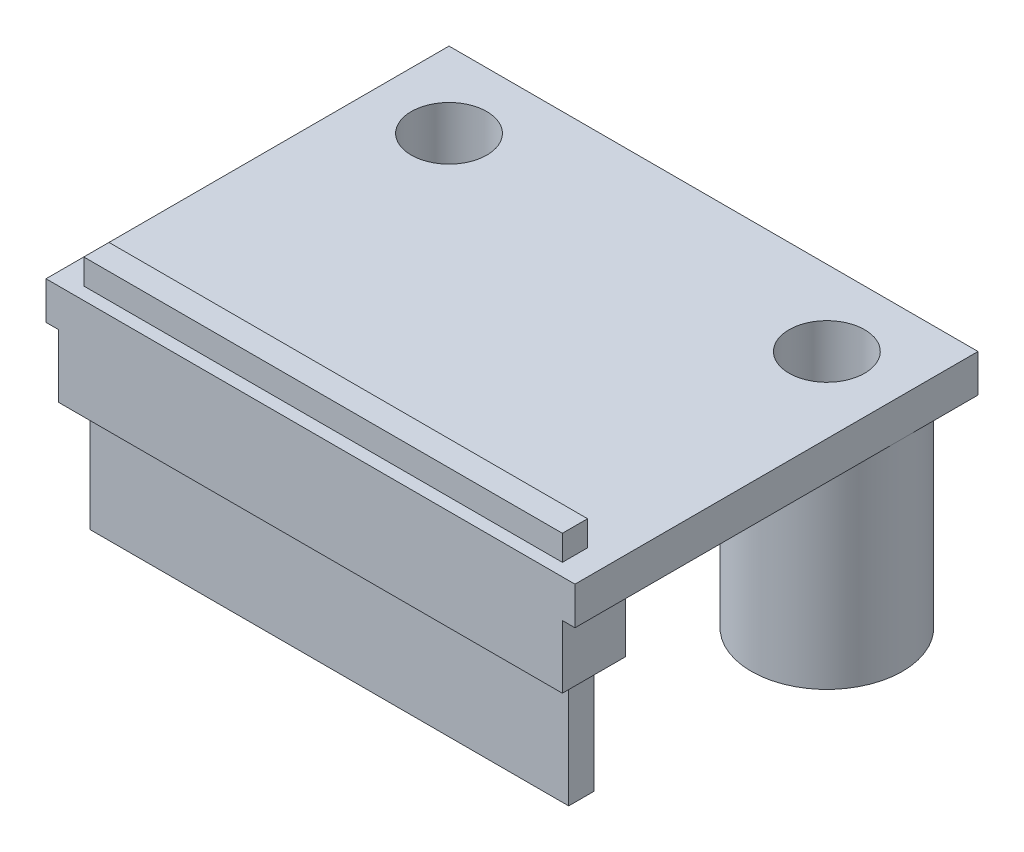
ISO-10303-21;
HEADER;
FILE_DESCRIPTION(('STEP AP214'),'2;1');
FILE_NAME('part.step','',(''),(''),'','','');
FILE_SCHEMA(('AUTOMOTIVE_DESIGN { 1 0 10303 214 1 1 1 1 }'));
ENDSEC;
DATA;
#1=APPLICATION_CONTEXT('core data for automotive mechanical design processes');
#2=APPLICATION_PROTOCOL_DEFINITION('international standard','automotive_design',2000,#1);
#3=PRODUCT_CONTEXT('',#1,'mechanical');
#4=PRODUCT('Part','Part','',(#3));
#5=PRODUCT_RELATED_PRODUCT_CATEGORY('part','',(#4));
#6=PRODUCT_DEFINITION_FORMATION('','',#4);
#7=PRODUCT_DEFINITION_CONTEXT('part definition',#1,'design');
#8=PRODUCT_DEFINITION('design','',#6,#7);
#9=PRODUCT_DEFINITION_SHAPE('','',#8);
#10=(LENGTH_UNIT() NAMED_UNIT(*) SI_UNIT(.MILLI.,.METRE.));
#11=(NAMED_UNIT(*) PLANE_ANGLE_UNIT() SI_UNIT($,.RADIAN.));
#12=(NAMED_UNIT(*) SI_UNIT($,.STERADIAN.) SOLID_ANGLE_UNIT());
#13=UNCERTAINTY_MEASURE_WITH_UNIT(LENGTH_MEASURE(1.E-05),#10,'distance_accuracy_value','');
#14=(GEOMETRIC_REPRESENTATION_CONTEXT(3) GLOBAL_UNCERTAINTY_ASSIGNED_CONTEXT((#13)) GLOBAL_UNIT_ASSIGNED_CONTEXT((#10,
#11,#12)) REPRESENTATION_CONTEXT('',''));
#15=CARTESIAN_POINT('',(0.,0.,0.));
#16=DIRECTION('',(0.,0.,1.));
#17=DIRECTION('',(1.,0.,0.));
#18=AXIS2_PLACEMENT_3D('',#15,#16,#17);
#19=CARTESIAN_POINT('',(0.,-1.5,0.));
#20=DIRECTION('',(0.,1.,0.));
#21=DIRECTION('',(0.,0.,1.));
#22=AXIS2_PLACEMENT_3D('',#19,#20,#21);
#23=PLANE('',#22);
#24=CARTESIAN_POINT('',(7.50000000000001,-1.5,-5.00000000000001));
#25=DIRECTION('',(0.,-1.,0.));
#26=DIRECTION('',(0.,0.,-1.));
#27=AXIS2_PLACEMENT_3D('',#24,#25,#26);
#28=CIRCLE('',#27,3.);
#29=CARTESIAN_POINT('',(7.50000000000001,-1.5,-7.99999999999999));
#30=VERTEX_POINT('',#29);
#31=CARTESIAN_POINT('',(10.5,-1.5,-5.00000000000001));
#32=VERTEX_POINT('',#31);
#33=EDGE_CURVE('E200',#30,#32,#28,.T.);
#34=ORIENTED_EDGE('',*,*,#33,.F.);
#35=DIRECTION('',(1.,0.,0.));
#36=VECTOR('',#35,1.);
#37=CARTESIAN_POINT('',(0.,-1.5,-7.99999999999999));
#38=LINE('',#37,#36);
#39=CARTESIAN_POINT('',(10.5,-1.5,-7.99999999999999));
#40=VERTEX_POINT('',#39);
#41=EDGE_CURVE('E188',#30,#40,#38,.T.);
#42=ORIENTED_EDGE('',*,*,#41,.T.);
#43=DIRECTION('',(0.,0.,1.));
#44=VECTOR('',#43,1.);
#45=CARTESIAN_POINT('',(10.5,-1.5,0.));
#46=LINE('',#45,#44);
#47=EDGE_CURVE('E198',#40,#32,#46,.T.);
#48=ORIENTED_EDGE('',*,*,#47,.T.);
#49=EDGE_LOOP('',(#34,#42,#48));
#50=FACE_BOUND('',#49,.T.);
#51=ADVANCED_FACE('F59',(#50),#23,.F.);
#52=CARTESIAN_POINT('',(-7.50000000000001,-1.5,-5.00000000000001));
#53=DIRECTION('',(0.,-1.,0.));
#54=DIRECTION('',(0.,0.,-1.));
#55=AXIS2_PLACEMENT_3D('',#52,#53,#54);
#56=CIRCLE('',#55,3.);
#57=CARTESIAN_POINT('',(-10.5,-1.5,-5.00000000000001));
#58=VERTEX_POINT('',#57);
#59=CARTESIAN_POINT('',(-7.50000000000001,-1.5,-7.99999999999999));
#60=VERTEX_POINT('',#59);
#61=EDGE_CURVE('E217',#58,#60,#56,.T.);
#62=ORIENTED_EDGE('',*,*,#61,.F.);
#63=DIRECTION('',(0.,0.,1.));
#64=VECTOR('',#63,1.);
#65=CARTESIAN_POINT('',(-10.5,-1.5,0.));
#66=LINE('',#65,#64);
#67=CARTESIAN_POINT('',(-10.5,-1.5,-7.99999999999999));
#68=VERTEX_POINT('',#67);
#69=EDGE_CURVE('E312',#68,#58,#66,.T.);
#70=ORIENTED_EDGE('',*,*,#69,.F.);
#71=EDGE_CURVE('E187',#68,#60,#38,.T.);
#72=ORIENTED_EDGE('',*,*,#71,.T.);
#73=EDGE_LOOP('',(#62,#70,#72));
#74=FACE_BOUND('',#73,.T.);
#75=ADVANCED_FACE('F374',(#74),#23,.F.);
#76=EDGE_CURVE('E74',#32,#30,#28,.T.);
#77=ORIENTED_EDGE('',*,*,#76,.F.);
#78=CARTESIAN_POINT('',(10.5,-1.5,8.00000000000001));
#79=VERTEX_POINT('',#78);
#80=EDGE_CURVE('E309',#32,#79,#46,.T.);
#81=ORIENTED_EDGE('',*,*,#80,.T.);
#82=DIRECTION('',(1.,0.,0.));
#83=VECTOR('',#82,1.);
#84=CARTESIAN_POINT('',(0.,-1.5,8.));
#85=LINE('',#84,#83);
#86=CARTESIAN_POINT('',(10.,-1.5,8.00000000000001));
#87=VERTEX_POINT('',#86);
#88=EDGE_CURVE('E314',#87,#79,#85,.T.);
#89=ORIENTED_EDGE('',*,*,#88,.F.);
#90=DIRECTION('',(0.,0.,-1.));
#91=VECTOR('',#90,1.);
#92=CARTESIAN_POINT('',(10.,-1.5,7.99999999999999));
#93=LINE('',#92,#91);
#94=CARTESIAN_POINT('',(10.,-1.5,5.49999999999999));
#95=VERTEX_POINT('',#94);
#96=EDGE_CURVE('E222',#87,#95,#93,.T.);
#97=ORIENTED_EDGE('',*,*,#96,.T.);
#98=DIRECTION('',(1.,0.,0.));
#99=VECTOR('',#98,1.);
#100=CARTESIAN_POINT('',(-10.,-1.5,5.49999999999999));
#101=LINE('',#100,#99);
#102=CARTESIAN_POINT('',(-10.,-1.5,5.49999999999999));
#103=VERTEX_POINT('',#102);
#104=EDGE_CURVE('E233',#103,#95,#101,.T.);
#105=ORIENTED_EDGE('',*,*,#104,.F.);
#106=DIRECTION('',(0.,0.,-1.));
#107=VECTOR('',#106,1.);
#108=CARTESIAN_POINT('',(-10.,-1.5,7.99999999999999));
#109=LINE('',#108,#107);
#110=CARTESIAN_POINT('',(-10.,-1.5,7.99999999999999));
#111=VERTEX_POINT('',#110);
#112=EDGE_CURVE('E215',#111,#103,#109,.T.);
#113=ORIENTED_EDGE('',*,*,#112,.F.);
#114=CARTESIAN_POINT('',(-10.5,-1.5,7.99999999999999));
#115=VERTEX_POINT('',#114);
#116=EDGE_CURVE('E315',#115,#111,#85,.T.);
#117=ORIENTED_EDGE('',*,*,#116,.F.);
#118=EDGE_CURVE('E311',#58,#115,#66,.T.);
#119=ORIENTED_EDGE('',*,*,#118,.F.);
#120=EDGE_CURVE('E80',#60,#58,#56,.T.);
#121=ORIENTED_EDGE('',*,*,#120,.F.);
#122=EDGE_CURVE('E181',#60,#30,#38,.T.);
#123=ORIENTED_EDGE('',*,*,#122,.T.);
#124=EDGE_LOOP('',(#77,#81,#89,#97,#105,#113,#117,#119,#121,#123));
#125=FACE_BOUND('',#124,.T.);
#126=ADVANCED_FACE('F183',(#125),#23,.F.);
#127=CARTESIAN_POINT('',(0.,0.,0.));
#128=DIRECTION('',(0.,1.,0.));
#129=DIRECTION('',(0.,0.,1.));
#130=AXIS2_PLACEMENT_3D('',#127,#128,#129);
#131=PLANE('',#130);
#132=CARTESIAN_POINT('',(7.50000000000001,0.,-5.00000000000001));
#133=DIRECTION('',(0.,1.,0.));
#134=DIRECTION('',(0.,0.,1.));
#135=AXIS2_PLACEMENT_3D('',#132,#133,#134);
#136=CIRCLE('',#135,1.5);
#137=CARTESIAN_POINT('',(7.50000000000001,0.,-3.50000000000001));
#138=VERTEX_POINT('',#137);
#139=EDGE_CURVE('E308',#138,#138,#136,.T.);
#140=ORIENTED_EDGE('',*,*,#139,.F.);
#141=EDGE_LOOP('',(#140));
#142=FACE_BOUND('',#141,.T.);
#143=CARTESIAN_POINT('',(-7.50000000000001,0.,-5.00000000000001));
#144=DIRECTION('',(0.,1.,0.));
#145=DIRECTION('',(0.,0.,1.));
#146=AXIS2_PLACEMENT_3D('',#143,#144,#145);
#147=CIRCLE('',#146,1.5);
#148=CARTESIAN_POINT('',(-7.50000000000001,0.,-3.50000000000001));
#149=VERTEX_POINT('',#148);
#150=EDGE_CURVE('E320',#149,#149,#147,.T.);
#151=ORIENTED_EDGE('',*,*,#150,.F.);
#152=EDGE_LOOP('',(#151));
#153=FACE_BOUND('',#152,.T.);
#154=DIRECTION('',(0.,0.,1.));
#155=VECTOR('',#154,1.);
#156=CARTESIAN_POINT('',(10.5,0.,0.));
#157=LINE('',#156,#155);
#158=CARTESIAN_POINT('',(10.5,0.,-7.99999999999999));
#159=VERTEX_POINT('',#158);
#160=CARTESIAN_POINT('',(10.5,0.,8.00000000000001));
#161=VERTEX_POINT('',#160);
#162=EDGE_CURVE('E323',#159,#161,#157,.T.);
#163=ORIENTED_EDGE('',*,*,#162,.F.);
#164=DIRECTION('',(1.,0.,0.));
#165=VECTOR('',#164,1.);
#166=CARTESIAN_POINT('',(0.,0.,-7.99999999999999));
#167=LINE('',#166,#165);
#168=CARTESIAN_POINT('',(-10.5,0.,-7.99999999999999));
#169=VERTEX_POINT('',#168);
#170=EDGE_CURVE('E326',#169,#159,#167,.T.);
#171=ORIENTED_EDGE('',*,*,#170,.F.);
#172=DIRECTION('',(0.,0.,1.));
#173=VECTOR('',#172,1.);
#174=CARTESIAN_POINT('',(-10.5,0.,0.));
#175=LINE('',#174,#173);
#176=CARTESIAN_POINT('',(-10.5,0.,7.99999999999999));
#177=VERTEX_POINT('',#176);
#178=EDGE_CURVE('E328',#169,#177,#175,.T.);
#179=ORIENTED_EDGE('',*,*,#178,.T.);
#180=DIRECTION('',(1.,0.,0.));
#181=VECTOR('',#180,1.);
#182=CARTESIAN_POINT('',(0.,0.,8.));
#183=LINE('',#182,#181);
#184=EDGE_CURVE('E331',#177,#161,#183,.T.);
#185=ORIENTED_EDGE('',*,*,#184,.T.);
#186=EDGE_LOOP('',(#163,#171,#179,#185));
#187=FACE_BOUND('',#186,.T.);
#188=DIRECTION('',(1.,0.,0.));
#189=VECTOR('',#188,1.);
#190=CARTESIAN_POINT('',(-9.50000000000002,0.,7.49999999999999));
#191=LINE('',#190,#189);
#192=CARTESIAN_POINT('',(-9.50000000000002,0.,7.49999999999999));
#193=VERTEX_POINT('',#192);
#194=CARTESIAN_POINT('',(9.49999999999998,0.,7.49999999999999));
#195=VERTEX_POINT('',#194);
#196=EDGE_CURVE('E291',#193,#195,#191,.T.);
#197=ORIENTED_EDGE('',*,*,#196,.F.);
#198=DIRECTION('',(0.,0.,1.));
#199=VECTOR('',#198,1.);
#200=CARTESIAN_POINT('',(-9.50000000000002,0.,6.49999999999999));
#201=LINE('',#200,#199);
#202=CARTESIAN_POINT('',(-9.50000000000002,0.,6.49999999999999));
#203=VERTEX_POINT('',#202);
#204=EDGE_CURVE('E275',#203,#193,#201,.T.);
#205=ORIENTED_EDGE('',*,*,#204,.F.);
#206=DIRECTION('',(1.,0.,0.));
#207=VECTOR('',#206,1.);
#208=CARTESIAN_POINT('',(-9.50000000000002,0.,6.49999999999999));
#209=LINE('',#208,#207);
#210=CARTESIAN_POINT('',(9.49999999999998,0.,6.49999999999999));
#211=VERTEX_POINT('',#210);
#212=EDGE_CURVE('E280',#203,#211,#209,.T.);
#213=ORIENTED_EDGE('',*,*,#212,.T.);
#214=DIRECTION('',(0.,0.,1.));
#215=VECTOR('',#214,1.);
#216=CARTESIAN_POINT('',(9.49999999999998,0.,6.49999999999999));
#217=LINE('',#216,#215);
#218=EDGE_CURVE('E294',#211,#195,#217,.T.);
#219=ORIENTED_EDGE('',*,*,#218,.T.);
#220=EDGE_LOOP('',(#197,#205,#213,#219));
#221=FACE_BOUND('',#220,.T.);
#222=ADVANCED_FACE('F344',(#142,#153,#187,#221),#131,.T.);
#223=CARTESIAN_POINT('',(0.,-1.5,8.));
#224=DIRECTION('',(0.,0.,1.));
#225=DIRECTION('',(1.,0.,0.));
#226=AXIS2_PLACEMENT_3D('',#223,#224,#225);
#227=PLANE('',#226);
#228=ORIENTED_EDGE('',*,*,#184,.F.);
#229=DIRECTION('',(0.,1.,0.));
#230=VECTOR('',#229,1.);
#231=CARTESIAN_POINT('',(-10.5,-1.5,7.99999999999999));
#232=LINE('',#231,#230);
#233=EDGE_CURVE('E335',#115,#177,#232,.T.);
#234=ORIENTED_EDGE('',*,*,#233,.F.);
#235=ORIENTED_EDGE('',*,*,#116,.T.);
#236=DIRECTION('',(0.,1.,0.));
#237=VECTOR('',#236,1.);
#238=CARTESIAN_POINT('',(-10.,-4.,7.99999999999999));
#239=LINE('',#238,#237);
#240=CARTESIAN_POINT('',(-10.,-4.,7.99999999999999));
#241=VERTEX_POINT('',#240);
#242=EDGE_CURVE('E230',#241,#111,#239,.T.);
#243=ORIENTED_EDGE('',*,*,#242,.F.);
#244=DIRECTION('',(1.,0.,0.));
#245=VECTOR('',#244,1.);
#246=CARTESIAN_POINT('',(-10.,-4.,7.99999999999999));
#247=LINE('',#246,#245);
#248=CARTESIAN_POINT('',(10.,-4.,7.99999999999999));
#249=VERTEX_POINT('',#248);
#250=EDGE_CURVE('E227',#241,#249,#247,.T.);
#251=ORIENTED_EDGE('',*,*,#250,.T.);
#252=DIRECTION('',(0.,1.,0.));
#253=VECTOR('',#252,1.);
#254=CARTESIAN_POINT('',(10.,-4.,7.99999999999999));
#255=LINE('',#254,#253);
#256=EDGE_CURVE('E239',#249,#87,#255,.T.);
#257=ORIENTED_EDGE('',*,*,#256,.T.);
#258=ORIENTED_EDGE('',*,*,#88,.T.);
#259=DIRECTION('',(0.,1.,0.));
#260=VECTOR('',#259,1.);
#261=CARTESIAN_POINT('',(10.5,-1.5,8.00000000000001));
#262=LINE('',#261,#260);
#263=EDGE_CURVE('E67',#79,#161,#262,.T.);
#264=ORIENTED_EDGE('',*,*,#263,.T.);
#265=EDGE_LOOP('',(#228,#234,#235,#243,#251,#257,#258,#264));
#266=FACE_BOUND('',#265,.T.);
#267=ADVANCED_FACE('F350',(#266),#227,.T.);
#268=CARTESIAN_POINT('',(-10.5,-1.5,0.));
#269=DIRECTION('',(-1.,0.,0.));
#270=DIRECTION('',(0.,0.,1.));
#271=AXIS2_PLACEMENT_3D('',#268,#269,#270);
#272=PLANE('',#271);
#273=ORIENTED_EDGE('',*,*,#178,.F.);
#274=DIRECTION('',(0.,1.,0.));
#275=VECTOR('',#274,1.);
#276=CARTESIAN_POINT('',(-10.5,-1.5,-7.99999999999999));
#277=LINE('',#276,#275);
#278=EDGE_CURVE('E337',#68,#169,#277,.T.);
#279=ORIENTED_EDGE('',*,*,#278,.F.);
#280=ORIENTED_EDGE('',*,*,#69,.T.);
#281=ORIENTED_EDGE('',*,*,#118,.T.);
#282=ORIENTED_EDGE('',*,*,#233,.T.);
#283=EDGE_LOOP('',(#273,#279,#280,#281,#282));
#284=FACE_BOUND('',#283,.T.);
#285=ADVANCED_FACE('F408',(#284),#272,.T.);
#286=CARTESIAN_POINT('',(0.,-1.5,-7.99999999999999));
#287=DIRECTION('',(0.,0.,1.));
#288=DIRECTION('',(1.,0.,0.));
#289=AXIS2_PLACEMENT_3D('',#286,#287,#288);
#290=PLANE('',#289);
#291=ORIENTED_EDGE('',*,*,#170,.T.);
#292=DIRECTION('',(0.,1.,0.));
#293=VECTOR('',#292,1.);
#294=CARTESIAN_POINT('',(10.5,-1.5,-7.99999999999999));
#295=LINE('',#294,#293);
#296=EDGE_CURVE('E194',#40,#159,#295,.T.);
#297=ORIENTED_EDGE('',*,*,#296,.F.);
#298=ORIENTED_EDGE('',*,*,#41,.F.);
#299=ORIENTED_EDGE('',*,*,#122,.F.);
#300=ORIENTED_EDGE('',*,*,#71,.F.);
#301=ORIENTED_EDGE('',*,*,#278,.T.);
#302=EDGE_LOOP('',(#291,#297,#298,#299,#300,#301));
#303=FACE_BOUND('',#302,.T.);
#304=ADVANCED_FACE('F192',(#303),#290,.F.);
#305=CARTESIAN_POINT('',(10.5,-1.5,0.));
#306=DIRECTION('',(-1.,0.,0.));
#307=DIRECTION('',(0.,0.,1.));
#308=AXIS2_PLACEMENT_3D('',#305,#306,#307);
#309=PLANE('',#308);
#310=ORIENTED_EDGE('',*,*,#162,.T.);
#311=ORIENTED_EDGE('',*,*,#263,.F.);
#312=ORIENTED_EDGE('',*,*,#80,.F.);
#313=ORIENTED_EDGE('',*,*,#47,.F.);
#314=ORIENTED_EDGE('',*,*,#296,.T.);
#315=EDGE_LOOP('',(#310,#311,#312,#313,#314));
#316=FACE_BOUND('',#315,.T.);
#317=ADVANCED_FACE('F340',(#316),#309,.F.);
#318=CARTESIAN_POINT('',(-7.50000000000001,-1.5,-5.00000000000001));
#319=DIRECTION('',(0.,1.,0.));
#320=DIRECTION('',(0.,0.,1.));
#321=AXIS2_PLACEMENT_3D('',#318,#319,#320);
#322=CYLINDRICAL_SURFACE('',#321,1.5);
#323=ORIENTED_EDGE('',*,*,#150,.T.);
#324=EDGE_LOOP('',(#323));
#325=FACE_BOUND('',#324,.T.);
#326=CARTESIAN_POINT('',(-7.50000000000001,-9.5,-5.00000000000001));
#327=DIRECTION('',(0.,-1.,0.));
#328=DIRECTION('',(0.,0.,-1.));
#329=AXIS2_PLACEMENT_3D('',#326,#327,#328);
#330=CIRCLE('',#329,1.5);
#331=CARTESIAN_POINT('',(-7.50000000000001,-9.5,-6.50000000000001));
#332=VERTEX_POINT('',#331);
#333=EDGE_CURVE('E209',#332,#332,#330,.F.);
#334=ORIENTED_EDGE('',*,*,#333,.F.);
#335=EDGE_LOOP('',(#334));
#336=FACE_BOUND('',#335,.T.);
#337=ADVANCED_FACE('F418',(#325,#336),#322,.F.);
#338=CARTESIAN_POINT('',(7.50000000000001,-1.5,-5.00000000000001));
#339=DIRECTION('',(0.,1.,0.));
#340=DIRECTION('',(0.,0.,1.));
#341=AXIS2_PLACEMENT_3D('',#338,#339,#340);
#342=CYLINDRICAL_SURFACE('',#341,1.5);
#343=ORIENTED_EDGE('',*,*,#139,.T.);
#344=EDGE_LOOP('',(#343));
#345=FACE_BOUND('',#344,.T.);
#346=CARTESIAN_POINT('',(7.50000000000001,-9.5,-5.00000000000001));
#347=DIRECTION('',(0.,-1.,0.));
#348=DIRECTION('',(0.,0.,-1.));
#349=AXIS2_PLACEMENT_3D('',#346,#347,#348);
#350=CIRCLE('',#349,1.5);
#351=CARTESIAN_POINT('',(7.50000000000001,-9.5,-6.50000000000001));
#352=VERTEX_POINT('',#351);
#353=EDGE_CURVE('E202',#352,#352,#350,.F.);
#354=ORIENTED_EDGE('',*,*,#353,.F.);
#355=EDGE_LOOP('',(#354));
#356=FACE_BOUND('',#355,.T.);
#357=ADVANCED_FACE('F61',(#345,#356),#342,.F.);
#358=CARTESIAN_POINT('',(-9.50000000000002,1.,6.49999999999999));
#359=DIRECTION('',(1.,0.,0.));
#360=DIRECTION('',(0.,0.,-1.));
#361=AXIS2_PLACEMENT_3D('',#358,#359,#360);
#362=PLANE('',#361);
#363=ORIENTED_EDGE('',*,*,#204,.T.);
#364=DIRECTION('',(0.,-1.,0.));
#365=VECTOR('',#364,1.);
#366=CARTESIAN_POINT('',(-9.50000000000002,1.,7.49999999999999));
#367=LINE('',#366,#365);
#368=CARTESIAN_POINT('',(-9.50000000000002,1.,7.49999999999999));
#369=VERTEX_POINT('',#368);
#370=EDGE_CURVE('E305',#369,#193,#367,.T.);
#371=ORIENTED_EDGE('',*,*,#370,.F.);
#372=DIRECTION('',(0.,0.,1.));
#373=VECTOR('',#372,1.);
#374=CARTESIAN_POINT('',(-9.50000000000002,1.,6.49999999999999));
#375=LINE('',#374,#373);
#376=CARTESIAN_POINT('',(-9.50000000000002,1.,6.49999999999999));
#377=VERTEX_POINT('',#376);
#378=EDGE_CURVE('E276',#377,#369,#375,.T.);
#379=ORIENTED_EDGE('',*,*,#378,.F.);
#380=DIRECTION('',(0.,-1.,0.));
#381=VECTOR('',#380,1.);
#382=CARTESIAN_POINT('',(-9.50000000000002,1.,6.49999999999999));
#383=LINE('',#382,#381);
#384=EDGE_CURVE('E288',#377,#203,#383,.T.);
#385=ORIENTED_EDGE('',*,*,#384,.T.);
#386=EDGE_LOOP('',(#363,#371,#379,#385));
#387=FACE_BOUND('',#386,.T.);
#388=ADVANCED_FACE('F424',(#387),#362,.F.);
#389=CARTESIAN_POINT('',(-9.50000000000002,1.,7.49999999999999));
#390=DIRECTION('',(0.,0.,-1.));
#391=DIRECTION('',(-1.,0.,0.));
#392=AXIS2_PLACEMENT_3D('',#389,#390,#391);
#393=PLANE('',#392);
#394=ORIENTED_EDGE('',*,*,#196,.T.);
#395=DIRECTION('',(0.,-1.,0.));
#396=VECTOR('',#395,1.);
#397=CARTESIAN_POINT('',(9.49999999999998,1.,7.49999999999999));
#398=LINE('',#397,#396);
#399=CARTESIAN_POINT('',(9.49999999999998,1.,7.49999999999999));
#400=VERTEX_POINT('',#399);
#401=EDGE_CURVE('E302',#400,#195,#398,.T.);
#402=ORIENTED_EDGE('',*,*,#401,.F.);
#403=DIRECTION('',(1.,0.,0.));
#404=VECTOR('',#403,1.);
#405=CARTESIAN_POINT('',(-9.50000000000002,1.,7.49999999999999));
#406=LINE('',#405,#404);
#407=EDGE_CURVE('E279',#369,#400,#406,.T.);
#408=ORIENTED_EDGE('',*,*,#407,.F.);
#409=ORIENTED_EDGE('',*,*,#370,.T.);
#410=EDGE_LOOP('',(#394,#402,#408,#409));
#411=FACE_BOUND('',#410,.T.);
#412=ADVANCED_FACE('F433',(#411),#393,.F.);
#413=CARTESIAN_POINT('',(9.49999999999998,1.,6.49999999999999));
#414=DIRECTION('',(1.,0.,0.));
#415=DIRECTION('',(0.,0.,-1.));
#416=AXIS2_PLACEMENT_3D('',#413,#414,#415);
#417=PLANE('',#416);
#418=ORIENTED_EDGE('',*,*,#218,.F.);
#419=DIRECTION('',(0.,-1.,0.));
#420=VECTOR('',#419,1.);
#421=CARTESIAN_POINT('',(9.49999999999998,1.,6.49999999999999));
#422=LINE('',#421,#420);
#423=CARTESIAN_POINT('',(9.49999999999998,1.,6.49999999999999));
#424=VERTEX_POINT('',#423);
#425=EDGE_CURVE('E299',#424,#211,#422,.T.);
#426=ORIENTED_EDGE('',*,*,#425,.F.);
#427=DIRECTION('',(0.,0.,1.));
#428=VECTOR('',#427,1.);
#429=CARTESIAN_POINT('',(9.49999999999998,1.,6.49999999999999));
#430=LINE('',#429,#428);
#431=EDGE_CURVE('E282',#424,#400,#430,.T.);
#432=ORIENTED_EDGE('',*,*,#431,.T.);
#433=ORIENTED_EDGE('',*,*,#401,.T.);
#434=EDGE_LOOP('',(#418,#426,#432,#433));
#435=FACE_BOUND('',#434,.T.);
#436=ADVANCED_FACE('F612',(#435),#417,.T.);
#437=CARTESIAN_POINT('',(-9.50000000000002,1.,6.49999999999999));
#438=DIRECTION('',(0.,0.,-1.));
#439=DIRECTION('',(-1.,0.,0.));
#440=AXIS2_PLACEMENT_3D('',#437,#438,#439);
#441=PLANE('',#440);
#442=ORIENTED_EDGE('',*,*,#212,.F.);
#443=ORIENTED_EDGE('',*,*,#384,.F.);
#444=DIRECTION('',(1.,0.,0.));
#445=VECTOR('',#444,1.);
#446=CARTESIAN_POINT('',(-9.50000000000002,1.,6.49999999999999));
#447=LINE('',#446,#445);
#448=EDGE_CURVE('E285',#377,#424,#447,.T.);
#449=ORIENTED_EDGE('',*,*,#448,.T.);
#450=ORIENTED_EDGE('',*,*,#425,.T.);
#451=EDGE_LOOP('',(#442,#443,#449,#450));
#452=FACE_BOUND('',#451,.T.);
#453=ADVANCED_FACE('F602',(#452),#441,.T.);
#454=CARTESIAN_POINT('',(0.,1.,0.));
#455=DIRECTION('',(0.,1.,0.));
#456=DIRECTION('',(0.,0.,1.));
#457=AXIS2_PLACEMENT_3D('',#454,#455,#456);
#458=PLANE('',#457);
#459=ORIENTED_EDGE('',*,*,#378,.T.);
#460=ORIENTED_EDGE('',*,*,#407,.T.);
#461=ORIENTED_EDGE('',*,*,#431,.F.);
#462=ORIENTED_EDGE('',*,*,#448,.F.);
#463=EDGE_LOOP('',(#459,#460,#461,#462));
#464=FACE_BOUND('',#463,.T.);
#465=ADVANCED_FACE('F582',(#464),#458,.T.);
#466=CARTESIAN_POINT('',(-10.,-4.,7.99999999999999));
#467=DIRECTION('',(1.,0.,0.));
#468=DIRECTION('',(0.,0.,-1.));
#469=AXIS2_PLACEMENT_3D('',#466,#467,#468);
#470=PLANE('',#469);
#471=ORIENTED_EDGE('',*,*,#112,.T.);
#472=DIRECTION('',(0.,1.,0.));
#473=VECTOR('',#472,1.);
#474=CARTESIAN_POINT('',(-10.,-4.,5.49999999999999));
#475=LINE('',#474,#473);
#476=CARTESIAN_POINT('',(-10.,-4.,5.49999999999999));
#477=VERTEX_POINT('',#476);
#478=EDGE_CURVE('E244',#477,#103,#475,.T.);
#479=ORIENTED_EDGE('',*,*,#478,.F.);
#480=DIRECTION('',(0.,0.,-1.));
#481=VECTOR('',#480,1.);
#482=CARTESIAN_POINT('',(-10.,-4.,7.99999999999999));
#483=LINE('',#482,#481);
#484=EDGE_CURVE('E218',#241,#477,#483,.T.);
#485=ORIENTED_EDGE('',*,*,#484,.F.);
#486=ORIENTED_EDGE('',*,*,#242,.T.);
#487=EDGE_LOOP('',(#471,#479,#485,#486));
#488=FACE_BOUND('',#487,.T.);
#489=ADVANCED_FACE('F368',(#488),#470,.F.);
#490=CARTESIAN_POINT('',(-10.,-4.,5.49999999999999));
#491=DIRECTION('',(0.,0.,1.));
#492=DIRECTION('',(1.,0.,0.));
#493=AXIS2_PLACEMENT_3D('',#490,#491,#492);
#494=PLANE('',#493);
#495=ORIENTED_EDGE('',*,*,#104,.T.);
#496=DIRECTION('',(0.,1.,0.));
#497=VECTOR('',#496,1.);
#498=CARTESIAN_POINT('',(10.,-4.,5.49999999999999));
#499=LINE('',#498,#497);
#500=CARTESIAN_POINT('',(10.,-4.,5.49999999999999));
#501=VERTEX_POINT('',#500);
#502=EDGE_CURVE('E242',#501,#95,#499,.T.);
#503=ORIENTED_EDGE('',*,*,#502,.F.);
#504=DIRECTION('',(1.,0.,0.));
#505=VECTOR('',#504,1.);
#506=CARTESIAN_POINT('',(-10.,-4.,5.49999999999999));
#507=LINE('',#506,#505);
#508=EDGE_CURVE('E221',#477,#501,#507,.T.);
#509=ORIENTED_EDGE('',*,*,#508,.F.);
#510=ORIENTED_EDGE('',*,*,#478,.T.);
#511=EDGE_LOOP('',(#495,#503,#509,#510));
#512=FACE_BOUND('',#511,.T.);
#513=ADVANCED_FACE('F366',(#512),#494,.F.);
#514=CARTESIAN_POINT('',(10.,-4.,7.99999999999999));
#515=DIRECTION('',(1.,0.,0.));
#516=DIRECTION('',(0.,0.,-1.));
#517=AXIS2_PLACEMENT_3D('',#514,#515,#516);
#518=PLANE('',#517);
#519=ORIENTED_EDGE('',*,*,#96,.F.);
#520=ORIENTED_EDGE('',*,*,#256,.F.);
#521=DIRECTION('',(0.,0.,-1.));
#522=VECTOR('',#521,1.);
#523=CARTESIAN_POINT('',(10.,-4.,7.99999999999999));
#524=LINE('',#523,#522);
#525=EDGE_CURVE('E224',#249,#501,#524,.T.);
#526=ORIENTED_EDGE('',*,*,#525,.T.);
#527=ORIENTED_EDGE('',*,*,#502,.T.);
#528=EDGE_LOOP('',(#519,#520,#526,#527));
#529=FACE_BOUND('',#528,.T.);
#530=ADVANCED_FACE('F357',(#529),#518,.T.);
#531=CARTESIAN_POINT('',(0.,-4.,0.));
#532=DIRECTION('',(0.,-1.,0.));
#533=DIRECTION('',(0.,0.,-1.));
#534=AXIS2_PLACEMENT_3D('',#531,#532,#533);
#535=PLANE('',#534);
#536=DIRECTION('',(1.,0.,0.));
#537=VECTOR('',#536,1.);
#538=CARTESIAN_POINT('',(0.,-4.,7.24999999999999));
#539=LINE('',#538,#537);
#540=CARTESIAN_POINT('',(-9.5,-4.,7.24999999999999));
#541=VERTEX_POINT('',#540);
#542=CARTESIAN_POINT('',(9.5,-4.,7.24999999999999));
#543=VERTEX_POINT('',#542);
#544=EDGE_CURVE('E249',#541,#543,#539,.T.);
#545=ORIENTED_EDGE('',*,*,#544,.T.);
#546=DIRECTION('',(0.,0.,-1.));
#547=VECTOR('',#546,1.);
#548=CARTESIAN_POINT('',(9.5,-4.,0.));
#549=LINE('',#548,#547);
#550=CARTESIAN_POINT('',(9.5,-4.,6.24999999999999));
#551=VERTEX_POINT('',#550);
#552=EDGE_CURVE('E251',#543,#551,#549,.T.);
#553=ORIENTED_EDGE('',*,*,#552,.T.);
#554=DIRECTION('',(1.,0.,0.));
#555=VECTOR('',#554,1.);
#556=CARTESIAN_POINT('',(0.,-4.,6.24999999999999));
#557=LINE('',#556,#555);
#558=CARTESIAN_POINT('',(-9.5,-4.,6.24999999999999));
#559=VERTEX_POINT('',#558);
#560=EDGE_CURVE('E12',#559,#551,#557,.T.);
#561=ORIENTED_EDGE('',*,*,#560,.F.);
#562=DIRECTION('',(0.,0.,-1.));
#563=VECTOR('',#562,1.);
#564=CARTESIAN_POINT('',(-9.49999999999998,-4.,0.));
#565=LINE('',#564,#563);
#566=EDGE_CURVE('E246',#541,#559,#565,.T.);
#567=ORIENTED_EDGE('',*,*,#566,.F.);
#568=EDGE_LOOP('',(#545,#553,#561,#567));
#569=FACE_BOUND('',#568,.T.);
#570=ORIENTED_EDGE('',*,*,#484,.T.);
#571=ORIENTED_EDGE('',*,*,#508,.T.);
#572=ORIENTED_EDGE('',*,*,#525,.F.);
#573=ORIENTED_EDGE('',*,*,#250,.F.);
#574=EDGE_LOOP('',(#570,#571,#572,#573));
#575=FACE_BOUND('',#574,.T.);
#576=ADVANCED_FACE('F363',(#569,#575),#535,.T.);
#577=CARTESIAN_POINT('',(0.,-8.5,0.));
#578=DIRECTION('',(0.,-1.,0.));
#579=DIRECTION('',(0.,0.,-1.));
#580=AXIS2_PLACEMENT_3D('',#577,#578,#579);
#581=PLANE('',#580);
#582=DIRECTION('',(0.,0.,-1.));
#583=VECTOR('',#582,1.);
#584=CARTESIAN_POINT('',(9.5,-8.5,0.));
#585=LINE('',#584,#583);
#586=CARTESIAN_POINT('',(9.5,-8.5,7.24999999999999));
#587=VERTEX_POINT('',#586);
#588=CARTESIAN_POINT('',(9.5,-8.5,6.24999999999999));
#589=VERTEX_POINT('',#588);
#590=EDGE_CURVE('E253',#587,#589,#585,.T.);
#591=ORIENTED_EDGE('',*,*,#590,.F.);
#592=DIRECTION('',(1.,0.,0.));
#593=VECTOR('',#592,1.);
#594=CARTESIAN_POINT('',(0.,-8.5,7.24999999999999));
#595=LINE('',#594,#593);
#596=CARTESIAN_POINT('',(-9.5,-8.5,7.24999999999999));
#597=VERTEX_POINT('',#596);
#598=EDGE_CURVE('E256',#597,#587,#595,.T.);
#599=ORIENTED_EDGE('',*,*,#598,.F.);
#600=DIRECTION('',(0.,0.,-1.));
#601=VECTOR('',#600,1.);
#602=CARTESIAN_POINT('',(-9.49999999999998,-8.5,0.));
#603=LINE('',#602,#601);
#604=CARTESIAN_POINT('',(-9.5,-8.5,6.24999999999999));
#605=VERTEX_POINT('',#604);
#606=EDGE_CURVE('E259',#597,#605,#603,.T.);
#607=ORIENTED_EDGE('',*,*,#606,.T.);
#608=DIRECTION('',(1.,0.,0.));
#609=VECTOR('',#608,1.);
#610=CARTESIAN_POINT('',(0.,-8.5,6.24999999999999));
#611=LINE('',#610,#609);
#612=EDGE_CURVE('E261',#605,#589,#611,.T.);
#613=ORIENTED_EDGE('',*,*,#612,.T.);
#614=EDGE_LOOP('',(#591,#599,#607,#613));
#615=FACE_BOUND('',#614,.T.);
#616=ADVANCED_FACE('F548',(#615),#581,.T.);
#617=CARTESIAN_POINT('',(0.,-8.5,6.24999999999999));
#618=DIRECTION('',(0.,0.,1.));
#619=DIRECTION('',(1.,0.,0.));
#620=AXIS2_PLACEMENT_3D('',#617,#618,#619);
#621=PLANE('',#620);
#622=DIRECTION('',(0.,1.,0.));
#623=VECTOR('',#622,1.);
#624=CARTESIAN_POINT('',(-9.5,-8.5,6.24999999999999));
#625=LINE('',#624,#623);
#626=EDGE_CURVE('E266',#605,#559,#625,.T.);
#627=ORIENTED_EDGE('',*,*,#626,.T.);
#628=ORIENTED_EDGE('',*,*,#560,.T.);
#629=DIRECTION('',(0.,1.,0.));
#630=VECTOR('',#629,1.);
#631=CARTESIAN_POINT('',(9.5,-8.5,6.24999999999999));
#632=LINE('',#631,#630);
#633=EDGE_CURVE('E263',#589,#551,#632,.T.);
#634=ORIENTED_EDGE('',*,*,#633,.F.);
#635=ORIENTED_EDGE('',*,*,#612,.F.);
#636=EDGE_LOOP('',(#627,#628,#634,#635));
#637=FACE_BOUND('',#636,.T.);
#638=ADVANCED_FACE('F538',(#637),#621,.F.);
#639=CARTESIAN_POINT('',(-9.49999999999998,-8.5,0.));
#640=DIRECTION('',(1.,0.,0.));
#641=DIRECTION('',(0.,0.,-1.));
#642=AXIS2_PLACEMENT_3D('',#639,#640,#641);
#643=PLANE('',#642);
#644=DIRECTION('',(0.,1.,0.));
#645=VECTOR('',#644,1.);
#646=CARTESIAN_POINT('',(-9.5,-8.5,7.24999999999999));
#647=LINE('',#646,#645);
#648=EDGE_CURVE('E269',#597,#541,#647,.T.);
#649=ORIENTED_EDGE('',*,*,#648,.T.);
#650=ORIENTED_EDGE('',*,*,#566,.T.);
#651=ORIENTED_EDGE('',*,*,#626,.F.);
#652=ORIENTED_EDGE('',*,*,#606,.F.);
#653=EDGE_LOOP('',(#649,#650,#651,#652));
#654=FACE_BOUND('',#653,.T.);
#655=ADVANCED_FACE('F528',(#654),#643,.F.);
#656=CARTESIAN_POINT('',(0.,-8.5,7.24999999999999));
#657=DIRECTION('',(0.,0.,1.));
#658=DIRECTION('',(1.,0.,0.));
#659=AXIS2_PLACEMENT_3D('',#656,#657,#658);
#660=PLANE('',#659);
#661=ORIENTED_EDGE('',*,*,#544,.F.);
#662=ORIENTED_EDGE('',*,*,#648,.F.);
#663=ORIENTED_EDGE('',*,*,#598,.T.);
#664=DIRECTION('',(0.,1.,0.));
#665=VECTOR('',#664,1.);
#666=CARTESIAN_POINT('',(9.5,-8.5,7.24999999999999));
#667=LINE('',#666,#665);
#668=EDGE_CURVE('E272',#587,#543,#667,.T.);
#669=ORIENTED_EDGE('',*,*,#668,.T.);
#670=EDGE_LOOP('',(#661,#662,#663,#669));
#671=FACE_BOUND('',#670,.T.);
#672=ADVANCED_FACE('F388',(#671),#660,.T.);
#673=CARTESIAN_POINT('',(9.5,-8.5,0.));
#674=DIRECTION('',(1.,0.,0.));
#675=DIRECTION('',(0.,0.,-1.));
#676=AXIS2_PLACEMENT_3D('',#673,#674,#675);
#677=PLANE('',#676);
#678=ORIENTED_EDGE('',*,*,#552,.F.);
#679=ORIENTED_EDGE('',*,*,#668,.F.);
#680=ORIENTED_EDGE('',*,*,#590,.T.);
#681=ORIENTED_EDGE('',*,*,#633,.T.);
#682=EDGE_LOOP('',(#678,#679,#680,#681));
#683=FACE_BOUND('',#682,.T.);
#684=ADVANCED_FACE('F379',(#683),#677,.T.);
#685=CARTESIAN_POINT('',(-7.50000000000001,-9.5,-5.00000000000001));
#686=DIRECTION('',(0.,1.,0.));
#687=DIRECTION('',(0.,0.,1.));
#688=AXIS2_PLACEMENT_3D('',#685,#686,#687);
#689=CYLINDRICAL_SURFACE('',#688,3.);
#690=CARTESIAN_POINT('',(-7.50000000000001,-9.5,-5.00000000000001));
#691=DIRECTION('',(0.,-1.,0.));
#692=DIRECTION('',(0.,0.,-1.));
#693=AXIS2_PLACEMENT_3D('',#690,#691,#692);
#694=CIRCLE('',#693,3.);
#695=CARTESIAN_POINT('',(-7.50000000000001,-9.5,-8.00000000000001));
#696=VERTEX_POINT('',#695);
#697=EDGE_CURVE('E212',#696,#696,#694,.T.);
#698=ORIENTED_EDGE('',*,*,#697,.F.);
#699=EDGE_LOOP('',(#698));
#700=FACE_BOUND('',#699,.T.);
#701=ORIENTED_EDGE('',*,*,#120,.T.);
#702=ORIENTED_EDGE('',*,*,#61,.T.);
#703=EDGE_LOOP('',(#701,#702));
#704=FACE_BOUND('',#703,.T.);
#705=ADVANCED_FACE('F376',(#700,#704),#689,.T.);
#706=CARTESIAN_POINT('',(0.,-9.5,0.));
#707=DIRECTION('',(0.,-1.,0.));
#708=DIRECTION('',(0.,0.,-1.));
#709=AXIS2_PLACEMENT_3D('',#706,#707,#708);
#710=PLANE('',#709);
#711=ORIENTED_EDGE('',*,*,#333,.T.);
#712=EDGE_LOOP('',(#711));
#713=FACE_BOUND('',#712,.T.);
#714=ORIENTED_EDGE('',*,*,#697,.T.);
#715=EDGE_LOOP('',(#714));
#716=FACE_BOUND('',#715,.T.);
#717=ADVANCED_FACE('F378',(#713,#716),#710,.T.);
#718=CARTESIAN_POINT('',(7.50000000000001,-9.5,-5.00000000000001));
#719=DIRECTION('',(0.,1.,0.));
#720=DIRECTION('',(0.,0.,1.));
#721=AXIS2_PLACEMENT_3D('',#718,#719,#720);
#722=CYLINDRICAL_SURFACE('',#721,3.);
#723=CARTESIAN_POINT('',(7.50000000000001,-9.5,-5.00000000000001));
#724=DIRECTION('',(0.,-1.,0.));
#725=DIRECTION('',(0.,0.,-1.));
#726=AXIS2_PLACEMENT_3D('',#723,#724,#725);
#727=CIRCLE('',#726,3.);
#728=CARTESIAN_POINT('',(7.50000000000001,-9.5,-8.00000000000001));
#729=VERTEX_POINT('',#728);
#730=EDGE_CURVE('E207',#729,#729,#727,.T.);
#731=ORIENTED_EDGE('',*,*,#730,.F.);
#732=EDGE_LOOP('',(#731));
#733=FACE_BOUND('',#732,.T.);
#734=ORIENTED_EDGE('',*,*,#33,.T.);
#735=ORIENTED_EDGE('',*,*,#76,.T.);
#736=EDGE_LOOP('',(#734,#735));
#737=FACE_BOUND('',#736,.T.);
#738=ADVANCED_FACE('F204',(#733,#737),#722,.T.);
#739=CARTESIAN_POINT('',(0.,-9.5,0.));
#740=DIRECTION('',(0.,-1.,0.));
#741=DIRECTION('',(0.,0.,-1.));
#742=AXIS2_PLACEMENT_3D('',#739,#740,#741);
#743=PLANE('',#742);
#744=ORIENTED_EDGE('',*,*,#353,.T.);
#745=EDGE_LOOP('',(#744));
#746=FACE_BOUND('',#745,.T.);
#747=ORIENTED_EDGE('',*,*,#730,.T.);
#748=EDGE_LOOP('',(#747));
#749=FACE_BOUND('',#748,.T.);
#750=ADVANCED_FACE('F442',(#746,#749),#743,.T.);
#751=CLOSED_SHELL('',(#51,#75,#126,#222,#267,#285,#304,#317,#337,#357,#388,#412,#436,#453,#465,
#489,#513,#530,#576,#616,#638,#655,#672,#684,#705,#717,#738,#750));
#752=MANIFOLD_SOLID_BREP('B2',#751);
#753=ADVANCED_BREP_SHAPE_REPRESENTATION('',(#18,#752),#14);
#754=SHAPE_DEFINITION_REPRESENTATION(#9,#753);
ENDSEC;
END-ISO-10303-21;
